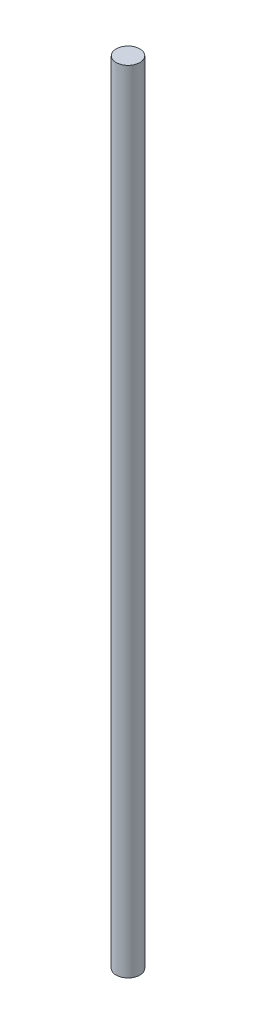
ISO-10303-21;
HEADER;
FILE_DESCRIPTION(('STEP AP214'),'2;1');
FILE_NAME('part.step','',(''),(''),'','','');
FILE_SCHEMA(('AUTOMOTIVE_DESIGN { 1 0 10303 214 1 1 1 1 }'));
ENDSEC;
DATA;
#1=APPLICATION_CONTEXT('core data for automotive mechanical design processes');
#2=APPLICATION_PROTOCOL_DEFINITION('international standard','automotive_design',2000,#1);
#3=PRODUCT_CONTEXT('',#1,'mechanical');
#4=PRODUCT('Part','Part','',(#3));
#5=PRODUCT_RELATED_PRODUCT_CATEGORY('part','',(#4));
#6=PRODUCT_DEFINITION_FORMATION('','',#4);
#7=PRODUCT_DEFINITION_CONTEXT('part definition',#1,'design');
#8=PRODUCT_DEFINITION('design','',#6,#7);
#9=PRODUCT_DEFINITION_SHAPE('','',#8);
#10=(LENGTH_UNIT() NAMED_UNIT(*) SI_UNIT(.MILLI.,.METRE.));
#11=(NAMED_UNIT(*) PLANE_ANGLE_UNIT() SI_UNIT($,.RADIAN.));
#12=(NAMED_UNIT(*) SI_UNIT($,.STERADIAN.) SOLID_ANGLE_UNIT());
#13=UNCERTAINTY_MEASURE_WITH_UNIT(LENGTH_MEASURE(1.E-05),#10,'distance_accuracy_value','');
#14=(GEOMETRIC_REPRESENTATION_CONTEXT(3) GLOBAL_UNCERTAINTY_ASSIGNED_CONTEXT((#13)) GLOBAL_UNIT_ASSIGNED_CONTEXT((#10,
#11,#12)) REPRESENTATION_CONTEXT('',''));
#15=CARTESIAN_POINT('',(0.,0.,0.));
#16=DIRECTION('',(0.,0.,1.));
#17=DIRECTION('',(1.,0.,0.));
#18=AXIS2_PLACEMENT_3D('',#15,#16,#17);
#19=CARTESIAN_POINT('',(0.,200.,0.));
#20=DIRECTION('',(0.,-1.,0.));
#21=DIRECTION('',(0.,0.,-1.));
#22=AXIS2_PLACEMENT_3D('',#19,#20,#21);
#23=CYLINDRICAL_SURFACE('',#22,3.);
#24=CARTESIAN_POINT('',(0.,200.,0.));
#25=DIRECTION('',(0.,1.,0.));
#26=DIRECTION('',(0.,0.,1.));
#27=AXIS2_PLACEMENT_3D('',#24,#25,#26);
#28=CIRCLE('',#27,3.);
#29=CARTESIAN_POINT('',(0.,200.,3.));
#30=VERTEX_POINT('',#29);
#31=EDGE_CURVE('E10',#30,#30,#28,.T.);
#32=ORIENTED_EDGE('',*,*,#31,.F.);
#33=EDGE_LOOP('',(#32));
#34=FACE_BOUND('',#33,.T.);
#35=CARTESIAN_POINT('',(0.,0.,0.));
#36=DIRECTION('',(0.,1.,0.));
#37=DIRECTION('',(0.,0.,1.));
#38=AXIS2_PLACEMENT_3D('',#35,#36,#37);
#39=CIRCLE('',#38,3.);
#40=CARTESIAN_POINT('',(0.,0.,3.));
#41=VERTEX_POINT('',#40);
#42=EDGE_CURVE('E40',#41,#41,#39,.T.);
#43=ORIENTED_EDGE('',*,*,#42,.T.);
#44=EDGE_LOOP('',(#43));
#45=FACE_BOUND('',#44,.T.);
#46=ADVANCED_FACE('F37',(#34,#45),#23,.T.);
#47=CARTESIAN_POINT('',(0.,200.,0.));
#48=DIRECTION('',(0.,1.,0.));
#49=DIRECTION('',(0.,0.,1.));
#50=AXIS2_PLACEMENT_3D('',#47,#48,#49);
#51=PLANE('',#50);
#52=ORIENTED_EDGE('',*,*,#31,.T.);
#53=EDGE_LOOP('',(#52));
#54=FACE_BOUND('',#53,.T.);
#55=ADVANCED_FACE('F54',(#54),#51,.T.);
#56=CARTESIAN_POINT('',(0.,0.,0.));
#57=DIRECTION('',(0.,1.,0.));
#58=DIRECTION('',(0.,0.,1.));
#59=AXIS2_PLACEMENT_3D('',#56,#57,#58);
#60=PLANE('',#59);
#61=ORIENTED_EDGE('',*,*,#42,.F.);
#62=EDGE_LOOP('',(#61));
#63=FACE_BOUND('',#62,.T.);
#64=ADVANCED_FACE('F52',(#63),#60,.F.);
#65=CLOSED_SHELL('',(#46,#55,#64));
#66=MANIFOLD_SOLID_BREP('B2',#65);
#67=ADVANCED_BREP_SHAPE_REPRESENTATION('',(#18,#66),#14);
#68=SHAPE_DEFINITION_REPRESENTATION(#9,#67);
ENDSEC;
END-ISO-10303-21;
